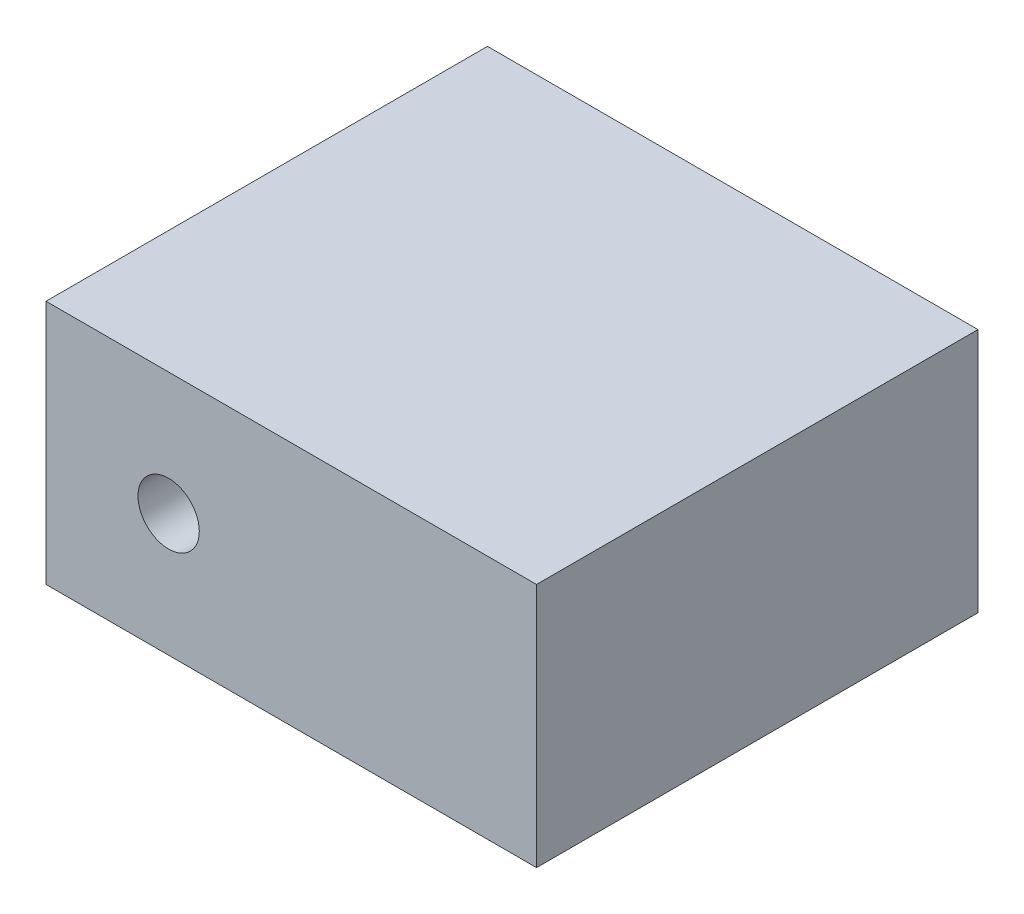
ISO-10303-21;
HEADER;
FILE_DESCRIPTION(('STEP AP214'),'2;1');
FILE_NAME('part.step','',(''),(''),'','','');
FILE_SCHEMA(('AUTOMOTIVE_DESIGN { 1 0 10303 214 1 1 1 1 }'));
ENDSEC;
DATA;
#1=APPLICATION_CONTEXT('core data for automotive mechanical design processes');
#2=APPLICATION_PROTOCOL_DEFINITION('international standard','automotive_design',2000,#1);
#3=PRODUCT_CONTEXT('',#1,'mechanical');
#4=PRODUCT('Part','Part','',(#3));
#5=PRODUCT_RELATED_PRODUCT_CATEGORY('part','',(#4));
#6=PRODUCT_DEFINITION_FORMATION('','',#4);
#7=PRODUCT_DEFINITION_CONTEXT('part definition',#1,'design');
#8=PRODUCT_DEFINITION('design','',#6,#7);
#9=PRODUCT_DEFINITION_SHAPE('','',#8);
#10=(LENGTH_UNIT() NAMED_UNIT(*) SI_UNIT(.MILLI.,.METRE.));
#11=(NAMED_UNIT(*) PLANE_ANGLE_UNIT() SI_UNIT($,.RADIAN.));
#12=(NAMED_UNIT(*) SI_UNIT($,.STERADIAN.) SOLID_ANGLE_UNIT());
#13=UNCERTAINTY_MEASURE_WITH_UNIT(LENGTH_MEASURE(1.E-05),#10,'distance_accuracy_value','');
#14=(GEOMETRIC_REPRESENTATION_CONTEXT(3) GLOBAL_UNCERTAINTY_ASSIGNED_CONTEXT((#13)) GLOBAL_UNIT_ASSIGNED_CONTEXT((#10,
#11,#12)) REPRESENTATION_CONTEXT('',''));
#15=CARTESIAN_POINT('',(0.,0.,0.));
#16=DIRECTION('',(0.,0.,1.));
#17=DIRECTION('',(1.,0.,0.));
#18=AXIS2_PLACEMENT_3D('',#15,#16,#17);
#19=CARTESIAN_POINT('',(0.,0.,18.));
#20=DIRECTION('',(1.,0.,0.));
#21=DIRECTION('',(0.,0.,-1.));
#22=AXIS2_PLACEMENT_3D('',#19,#20,#21);
#23=PLANE('',#22);
#24=DIRECTION('',(0.,-1.,0.));
#25=VECTOR('',#24,1.);
#26=CARTESIAN_POINT('',(0.,0.,-18.));
#27=LINE('',#26,#25);
#28=CARTESIAN_POINT('',(0.,20.,-18.));
#29=VERTEX_POINT('',#28);
#30=CARTESIAN_POINT('',(0.,0.,-18.));
#31=VERTEX_POINT('',#30);
#32=EDGE_CURVE('E109',#29,#31,#27,.T.);
#33=ORIENTED_EDGE('',*,*,#32,.T.);
#34=DIRECTION('',(0.,0.,-1.));
#35=VECTOR('',#34,1.);
#36=CARTESIAN_POINT('',(0.,0.,18.));
#37=LINE('',#36,#35);
#38=CARTESIAN_POINT('',(0.,0.,18.));
#39=VERTEX_POINT('',#38);
#40=EDGE_CURVE('E11',#39,#31,#37,.T.);
#41=ORIENTED_EDGE('',*,*,#40,.F.);
#42=DIRECTION('',(0.,-1.,0.));
#43=VECTOR('',#42,1.);
#44=CARTESIAN_POINT('',(0.,0.,18.));
#45=LINE('',#44,#43);
#46=CARTESIAN_POINT('',(0.,20.,18.));
#47=VERTEX_POINT('',#46);
#48=EDGE_CURVE('E93',#47,#39,#45,.T.);
#49=ORIENTED_EDGE('',*,*,#48,.F.);
#50=DIRECTION('',(0.,0.,-1.));
#51=VECTOR('',#50,1.);
#52=CARTESIAN_POINT('',(0.,20.,18.));
#53=LINE('',#52,#51);
#54=EDGE_CURVE('E105',#47,#29,#53,.T.);
#55=ORIENTED_EDGE('',*,*,#54,.T.);
#56=EDGE_LOOP('',(#33,#41,#49,#55));
#57=FACE_BOUND('',#56,.T.);
#58=ADVANCED_FACE('F41',(#57),#23,.F.);
#59=CARTESIAN_POINT('',(0.,0.,18.));
#60=DIRECTION('',(0.,1.,0.));
#61=DIRECTION('',(0.,0.,1.));
#62=AXIS2_PLACEMENT_3D('',#59,#60,#61);
#63=PLANE('',#62);
#64=DIRECTION('',(1.,0.,0.));
#65=VECTOR('',#64,1.);
#66=CARTESIAN_POINT('',(0.,0.,-18.));
#67=LINE('',#66,#65);
#68=CARTESIAN_POINT('',(40.,0.,-18.));
#69=VERTEX_POINT('',#68);
#70=EDGE_CURVE('E98',#31,#69,#67,.T.);
#71=ORIENTED_EDGE('',*,*,#70,.T.);
#72=DIRECTION('',(0.,0.,-1.));
#73=VECTOR('',#72,1.);
#74=CARTESIAN_POINT('',(40.,0.,18.));
#75=LINE('',#74,#73);
#76=CARTESIAN_POINT('',(40.,0.,18.));
#77=VERTEX_POINT('',#76);
#78=EDGE_CURVE('E50',#77,#69,#75,.T.);
#79=ORIENTED_EDGE('',*,*,#78,.F.);
#80=DIRECTION('',(1.,0.,0.));
#81=VECTOR('',#80,1.);
#82=CARTESIAN_POINT('',(0.,0.,18.));
#83=LINE('',#82,#81);
#84=EDGE_CURVE('E88',#39,#77,#83,.T.);
#85=ORIENTED_EDGE('',*,*,#84,.F.);
#86=ORIENTED_EDGE('',*,*,#40,.T.);
#87=EDGE_LOOP('',(#71,#79,#85,#86));
#88=FACE_BOUND('',#87,.T.);
#89=ADVANCED_FACE('F97',(#88),#63,.F.);
#90=CARTESIAN_POINT('',(40.,0.,18.));
#91=DIRECTION('',(-1.,0.,0.));
#92=DIRECTION('',(0.,0.,1.));
#93=AXIS2_PLACEMENT_3D('',#90,#91,#92);
#94=PLANE('',#93);
#95=DIRECTION('',(0.,1.,0.));
#96=VECTOR('',#95,1.);
#97=CARTESIAN_POINT('',(40.,0.,-18.));
#98=LINE('',#97,#96);
#99=CARTESIAN_POINT('',(40.,20.,-18.));
#100=VERTEX_POINT('',#99);
#101=EDGE_CURVE('E75',#69,#100,#98,.T.);
#102=ORIENTED_EDGE('',*,*,#101,.T.);
#103=DIRECTION('',(0.,0.,-1.));
#104=VECTOR('',#103,1.);
#105=CARTESIAN_POINT('',(40.,20.,18.));
#106=LINE('',#105,#104);
#107=CARTESIAN_POINT('',(40.,20.,18.));
#108=VERTEX_POINT('',#107);
#109=EDGE_CURVE('E100',#108,#100,#106,.T.);
#110=ORIENTED_EDGE('',*,*,#109,.F.);
#111=DIRECTION('',(0.,1.,0.));
#112=VECTOR('',#111,1.);
#113=CARTESIAN_POINT('',(40.,0.,18.));
#114=LINE('',#113,#112);
#115=EDGE_CURVE('E91',#77,#108,#114,.T.);
#116=ORIENTED_EDGE('',*,*,#115,.F.);
#117=ORIENTED_EDGE('',*,*,#78,.T.);
#118=EDGE_LOOP('',(#102,#110,#116,#117));
#119=FACE_BOUND('',#118,.T.);
#120=ADVANCED_FACE('F101',(#119),#94,.F.);
#121=CARTESIAN_POINT('',(0.,20.,18.));
#122=DIRECTION('',(0.,-1.,0.));
#123=DIRECTION('',(0.,0.,-1.));
#124=AXIS2_PLACEMENT_3D('',#121,#122,#123);
#125=PLANE('',#124);
#126=DIRECTION('',(-1.,0.,0.));
#127=VECTOR('',#126,1.);
#128=CARTESIAN_POINT('',(0.,20.,-18.));
#129=LINE('',#128,#127);
#130=EDGE_CURVE('E81',#100,#29,#129,.T.);
#131=ORIENTED_EDGE('',*,*,#130,.T.);
#132=ORIENTED_EDGE('',*,*,#54,.F.);
#133=DIRECTION('',(-1.,0.,0.));
#134=VECTOR('',#133,1.);
#135=CARTESIAN_POINT('',(0.,20.,18.));
#136=LINE('',#135,#134);
#137=EDGE_CURVE('E58',#108,#47,#136,.T.);
#138=ORIENTED_EDGE('',*,*,#137,.F.);
#139=ORIENTED_EDGE('',*,*,#109,.T.);
#140=EDGE_LOOP('',(#131,#132,#138,#139));
#141=FACE_BOUND('',#140,.T.);
#142=ADVANCED_FACE('F123',(#141),#125,.F.);
#143=CARTESIAN_POINT('',(0.,0.,18.));
#144=DIRECTION('',(0.,0.,-1.));
#145=DIRECTION('',(-1.,0.,0.));
#146=AXIS2_PLACEMENT_3D('',#143,#144,#145);
#147=PLANE('',#146);
#148=CARTESIAN_POINT('',(10.,10.,18.));
#149=DIRECTION('',(0.,0.,1.));
#150=DIRECTION('',(1.,0.,0.));
#151=AXIS2_PLACEMENT_3D('',#148,#149,#150);
#152=CIRCLE('',#151,2.5);
#153=CARTESIAN_POINT('',(12.5,10.,18.));
#154=VERTEX_POINT('',#153);
#155=EDGE_CURVE('E130',#154,#154,#152,.T.);
#156=ORIENTED_EDGE('',*,*,#155,.F.);
#157=EDGE_LOOP('',(#156));
#158=FACE_BOUND('',#157,.T.);
#159=ORIENTED_EDGE('',*,*,#48,.T.);
#160=ORIENTED_EDGE('',*,*,#84,.T.);
#161=ORIENTED_EDGE('',*,*,#115,.T.);
#162=ORIENTED_EDGE('',*,*,#137,.T.);
#163=EDGE_LOOP('',(#159,#160,#161,#162));
#164=FACE_BOUND('',#163,.T.);
#165=ADVANCED_FACE('F89',(#158,#164),#147,.F.);
#166=CARTESIAN_POINT('',(0.,0.,-18.));
#167=DIRECTION('',(0.,0.,-1.));
#168=DIRECTION('',(-1.,0.,0.));
#169=AXIS2_PLACEMENT_3D('',#166,#167,#168);
#170=PLANE('',#169);
#171=ORIENTED_EDGE('',*,*,#32,.F.);
#172=ORIENTED_EDGE('',*,*,#130,.F.);
#173=ORIENTED_EDGE('',*,*,#101,.F.);
#174=ORIENTED_EDGE('',*,*,#70,.F.);
#175=EDGE_LOOP('',(#171,#172,#173,#174));
#176=FACE_BOUND('',#175,.T.);
#177=ADVANCED_FACE('F126',(#176),#170,.T.);
#178=CARTESIAN_POINT('',(10.,10.,8.));
#179=DIRECTION('',(0.,0.,1.));
#180=DIRECTION('',(1.,0.,0.));
#181=AXIS2_PLACEMENT_3D('',#178,#179,#180);
#182=CYLINDRICAL_SURFACE('',#181,2.5);
#183=CARTESIAN_POINT('',(10.,10.,8.));
#184=DIRECTION('',(0.,0.,1.));
#185=DIRECTION('',(1.,0.,0.));
#186=AXIS2_PLACEMENT_3D('',#183,#184,#185);
#187=CIRCLE('',#186,2.5);
#188=CARTESIAN_POINT('',(12.5,10.,8.));
#189=VERTEX_POINT('',#188);
#190=EDGE_CURVE('E113',#189,#189,#187,.T.);
#191=ORIENTED_EDGE('',*,*,#190,.F.);
#192=EDGE_LOOP('',(#191));
#193=FACE_BOUND('',#192,.T.);
#194=ORIENTED_EDGE('',*,*,#155,.T.);
#195=EDGE_LOOP('',(#194));
#196=FACE_BOUND('',#195,.T.);
#197=ADVANCED_FACE('F140',(#193,#196),#182,.F.);
#198=CARTESIAN_POINT('',(10.,10.,8.));
#199=DIRECTION('',(0.,0.,1.));
#200=DIRECTION('',(1.,0.,0.));
#201=AXIS2_PLACEMENT_3D('',#198,#199,#200);
#202=PLANE('',#201);
#203=ORIENTED_EDGE('',*,*,#190,.T.);
#204=EDGE_LOOP('',(#203));
#205=FACE_BOUND('',#204,.T.);
#206=ADVANCED_FACE('F138',(#205),#202,.T.);
#207=CLOSED_SHELL('',(#58,#89,#120,#142,#165,#177,#197,#206));
#208=MANIFOLD_SOLID_BREP('B2',#207);
#209=ADVANCED_BREP_SHAPE_REPRESENTATION('',(#18,#208),#14);
#210=SHAPE_DEFINITION_REPRESENTATION(#9,#209);
ENDSEC;
END-ISO-10303-21;
